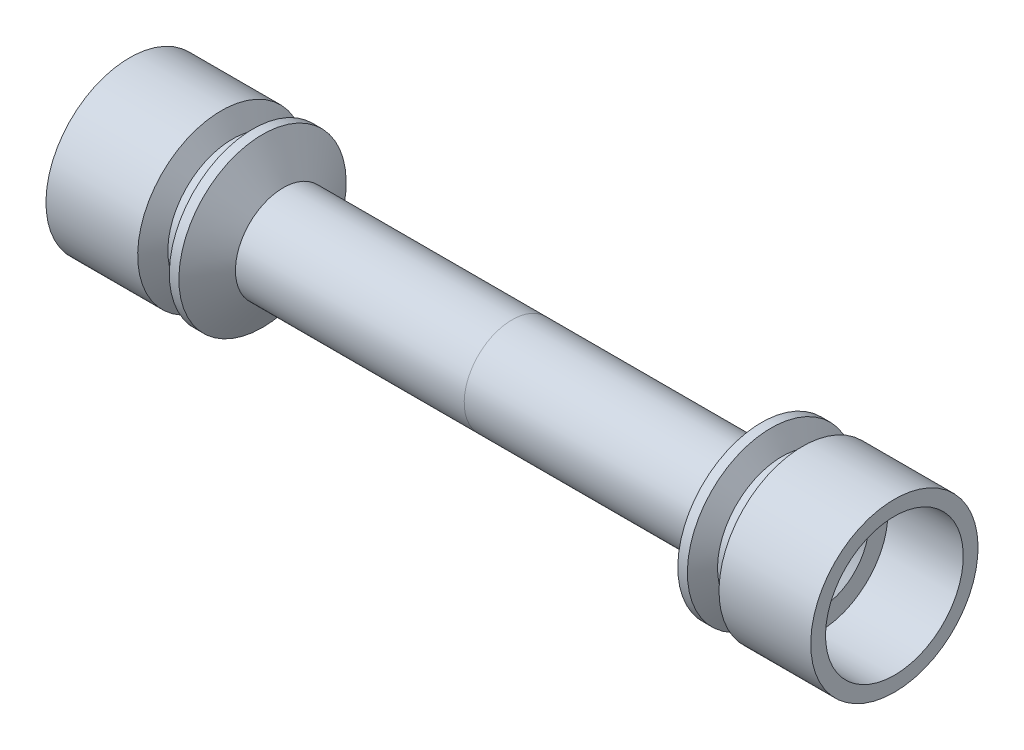
ISO-10303-21;
HEADER;
FILE_DESCRIPTION(('STEP AP214'),'2;1');
FILE_NAME('part.step','',(''),(''),'','','');
FILE_SCHEMA(('AUTOMOTIVE_DESIGN { 1 0 10303 214 1 1 1 1 }'));
ENDSEC;
DATA;
#1=APPLICATION_CONTEXT('core data for automotive mechanical design processes');
#2=APPLICATION_PROTOCOL_DEFINITION('international standard','automotive_design',2000,#1);
#3=PRODUCT_CONTEXT('',#1,'mechanical');
#4=PRODUCT('Part','Part','',(#3));
#5=PRODUCT_RELATED_PRODUCT_CATEGORY('part','',(#4));
#6=PRODUCT_DEFINITION_FORMATION('','',#4);
#7=PRODUCT_DEFINITION_CONTEXT('part definition',#1,'design');
#8=PRODUCT_DEFINITION('design','',#6,#7);
#9=PRODUCT_DEFINITION_SHAPE('','',#8);
#10=(LENGTH_UNIT() NAMED_UNIT(*) SI_UNIT(.MILLI.,.METRE.));
#11=(NAMED_UNIT(*) PLANE_ANGLE_UNIT() SI_UNIT($,.RADIAN.));
#12=(NAMED_UNIT(*) SI_UNIT($,.STERADIAN.) SOLID_ANGLE_UNIT());
#13=UNCERTAINTY_MEASURE_WITH_UNIT(LENGTH_MEASURE(1.E-05),#10,'distance_accuracy_value','');
#14=(GEOMETRIC_REPRESENTATION_CONTEXT(3) GLOBAL_UNCERTAINTY_ASSIGNED_CONTEXT((#13)) GLOBAL_UNIT_ASSIGNED_CONTEXT((#10,
#11,#12)) REPRESENTATION_CONTEXT('',''));
#15=CARTESIAN_POINT('',(0.,0.,0.));
#16=DIRECTION('',(0.,0.,1.));
#17=DIRECTION('',(1.,0.,0.));
#18=AXIS2_PLACEMENT_3D('',#15,#16,#17);
#19=CARTESIAN_POINT('',(16.5705151581292,0.,0.));
#20=DIRECTION('',(1.,0.,0.));
#21=DIRECTION('',(0.,-1.,0.));
#22=AXIS2_PLACEMENT_3D('',#19,#20,#21);
#23=CONICAL_SURFACE('',#22,5.55625,1.0471975511966);
#24=CARTESIAN_POINT('',(15.1956998296214,0.,0.));
#25=DIRECTION('',(-1.,0.,0.));
#26=DIRECTION('',(0.,-1.,0.));
#27=AXIS2_PLACEMENT_3D('',#24,#25,#26);
#28=CIRCLE('',#27,3.175);
#29=CARTESIAN_POINT('',(15.1956998296214,-3.175,0.));
#30=VERTEX_POINT('',#29);
#31=EDGE_CURVE('E177',#30,#30,#28,.T.);
#32=ORIENTED_EDGE('',*,*,#31,.F.);
#33=EDGE_LOOP('',(#32));
#34=FACE_BOUND('',#33,.T.);
#35=CARTESIAN_POINT('',(16.5705151581292,0.,0.));
#36=DIRECTION('',(-1.,0.,0.));
#37=DIRECTION('',(0.,-1.,0.));
#38=AXIS2_PLACEMENT_3D('',#35,#36,#37);
#39=CIRCLE('',#38,5.55625);
#40=CARTESIAN_POINT('',(16.5705151581292,-5.55625,0.));
#41=VERTEX_POINT('',#40);
#42=EDGE_CURVE('E12',#41,#41,#39,.T.);
#43=ORIENTED_EDGE('',*,*,#42,.T.);
#44=EDGE_LOOP('',(#43));
#45=FACE_BOUND('',#44,.T.);
#46=ADVANCED_FACE('F59',(#34,#45),#23,.T.);
#47=CARTESIAN_POINT('',(25.4,0.,0.));
#48=DIRECTION('',(1.,0.,0.));
#49=DIRECTION('',(0.,-1.,0.));
#50=AXIS2_PLACEMENT_3D('',#47,#48,#49);
#51=CYLINDRICAL_SURFACE('',#50,5.55625);
#52=ORIENTED_EDGE('',*,*,#42,.F.);
#53=EDGE_LOOP('',(#52));
#54=FACE_BOUND('',#53,.T.);
#55=CARTESIAN_POINT('',(17.2055151581292,0.,0.));
#56=DIRECTION('',(-1.,0.,0.));
#57=DIRECTION('',(0.,-1.,0.));
#58=AXIS2_PLACEMENT_3D('',#55,#56,#57);
#59=CIRCLE('',#58,5.55625);
#60=CARTESIAN_POINT('',(17.2055151581292,-5.55625,0.));
#61=VERTEX_POINT('',#60);
#62=EDGE_CURVE('E66',#61,#61,#59,.T.);
#63=ORIENTED_EDGE('',*,*,#62,.T.);
#64=EDGE_LOOP('',(#63));
#65=FACE_BOUND('',#64,.T.);
#66=ADVANCED_FACE('F131',(#54,#65),#51,.T.);
#67=CARTESIAN_POINT('',(17.93875,0.,0.));
#68=DIRECTION('',(-1.,0.,0.));
#69=DIRECTION('',(0.,1.,0.));
#70=AXIS2_PLACEMENT_3D('',#67,#68,#69);
#71=CONICAL_SURFACE('',#70,4.28625,1.0471975511966);
#72=ORIENTED_EDGE('',*,*,#62,.F.);
#73=EDGE_LOOP('',(#72));
#74=FACE_BOUND('',#73,.T.);
#75=CARTESIAN_POINT('',(17.93875,0.,0.));
#76=DIRECTION('',(-1.,0.,0.));
#77=DIRECTION('',(0.,-1.,0.));
#78=AXIS2_PLACEMENT_3D('',#75,#76,#77);
#79=CIRCLE('',#78,4.28625);
#80=CARTESIAN_POINT('',(17.93875,-4.28625,0.));
#81=VERTEX_POINT('',#80);
#82=EDGE_CURVE('E124',#81,#81,#79,.T.);
#83=ORIENTED_EDGE('',*,*,#82,.T.);
#84=EDGE_LOOP('',(#83));
#85=FACE_BOUND('',#84,.T.);
#86=ADVANCED_FACE('F133',(#74,#85),#71,.T.);
#87=CARTESIAN_POINT('',(25.4,0.,0.));
#88=DIRECTION('',(1.,0.,0.));
#89=DIRECTION('',(0.,-1.,0.));
#90=AXIS2_PLACEMENT_3D('',#87,#88,#89);
#91=CYLINDRICAL_SURFACE('',#90,4.28625);
#92=ORIENTED_EDGE('',*,*,#82,.F.);
#93=EDGE_LOOP('',(#92));
#94=FACE_BOUND('',#93,.T.);
#95=CARTESIAN_POINT('',(18.57375,0.,0.));
#96=DIRECTION('',(-1.,0.,0.));
#97=DIRECTION('',(0.,-1.,0.));
#98=AXIS2_PLACEMENT_3D('',#95,#96,#97);
#99=CIRCLE('',#98,4.28625);
#100=CARTESIAN_POINT('',(18.57375,-4.28625,0.));
#101=VERTEX_POINT('',#100);
#102=EDGE_CURVE('E120',#101,#101,#99,.T.);
#103=ORIENTED_EDGE('',*,*,#102,.T.);
#104=EDGE_LOOP('',(#103));
#105=FACE_BOUND('',#104,.T.);
#106=ADVANCED_FACE('F136',(#94,#105),#91,.T.);
#107=CARTESIAN_POINT('',(19.3069848418708,0.,0.));
#108=DIRECTION('',(1.,0.,0.));
#109=DIRECTION('',(0.,-1.,0.));
#110=AXIS2_PLACEMENT_3D('',#107,#108,#109);
#111=CONICAL_SURFACE('',#110,5.55625,1.0471975511966);
#112=ORIENTED_EDGE('',*,*,#102,.F.);
#113=EDGE_LOOP('',(#112));
#114=FACE_BOUND('',#113,.T.);
#115=CARTESIAN_POINT('',(19.3069848418708,0.,0.));
#116=DIRECTION('',(-1.,0.,0.));
#117=DIRECTION('',(0.,-1.,0.));
#118=AXIS2_PLACEMENT_3D('',#115,#116,#117);
#119=CIRCLE('',#118,5.55625);
#120=CARTESIAN_POINT('',(19.3069848418708,-5.55625,0.));
#121=VERTEX_POINT('',#120);
#122=EDGE_CURVE('E116',#121,#121,#119,.T.);
#123=ORIENTED_EDGE('',*,*,#122,.T.);
#124=EDGE_LOOP('',(#123));
#125=FACE_BOUND('',#124,.T.);
#126=ADVANCED_FACE('F142',(#114,#125),#111,.T.);
#127=CARTESIAN_POINT('',(25.4,0.,0.));
#128=DIRECTION('',(1.,0.,0.));
#129=DIRECTION('',(0.,-1.,0.));
#130=AXIS2_PLACEMENT_3D('',#127,#128,#129);
#131=CYLINDRICAL_SURFACE('',#130,5.55625);
#132=ORIENTED_EDGE('',*,*,#122,.F.);
#133=EDGE_LOOP('',(#132));
#134=FACE_BOUND('',#133,.T.);
#135=CARTESIAN_POINT('',(25.4,0.,0.));
#136=DIRECTION('',(-1.,0.,0.));
#137=DIRECTION('',(0.,-1.,0.));
#138=AXIS2_PLACEMENT_3D('',#135,#136,#137);
#139=CIRCLE('',#138,5.55625);
#140=CARTESIAN_POINT('',(25.4,-5.55625,0.));
#141=VERTEX_POINT('',#140);
#142=EDGE_CURVE('E112',#141,#141,#139,.T.);
#143=ORIENTED_EDGE('',*,*,#142,.T.);
#144=EDGE_LOOP('',(#143));
#145=FACE_BOUND('',#144,.T.);
#146=ADVANCED_FACE('F148',(#134,#145),#131,.T.);
#147=CARTESIAN_POINT('',(25.4,0.,0.));
#148=DIRECTION('',(-1.,0.,0.));
#149=DIRECTION('',(0.,1.,0.));
#150=AXIS2_PLACEMENT_3D('',#147,#148,#149);
#151=PLANE('',#150);
#152=CARTESIAN_POINT('',(25.4,0.,0.));
#153=DIRECTION('',(-1.,0.,0.));
#154=DIRECTION('',(0.,-1.,0.));
#155=AXIS2_PLACEMENT_3D('',#152,#153,#154);
#156=CIRCLE('',#155,4.575);
#157=CARTESIAN_POINT('',(25.4,-4.575,0.));
#158=VERTEX_POINT('',#157);
#159=EDGE_CURVE('E108',#158,#158,#156,.T.);
#160=ORIENTED_EDGE('',*,*,#159,.T.);
#161=EDGE_LOOP('',(#160));
#162=FACE_BOUND('',#161,.T.);
#163=ORIENTED_EDGE('',*,*,#142,.F.);
#164=EDGE_LOOP('',(#163));
#165=FACE_BOUND('',#164,.T.);
#166=ADVANCED_FACE('F154',(#162,#165),#151,.F.);
#167=CARTESIAN_POINT('',(25.4,0.,0.));
#168=DIRECTION('',(1.,0.,0.));
#169=DIRECTION('',(0.,-1.,0.));
#170=AXIS2_PLACEMENT_3D('',#167,#168,#169);
#171=CYLINDRICAL_SURFACE('',#170,4.575);
#172=CARTESIAN_POINT('',(20.4,0.,0.));
#173=DIRECTION('',(-1.,0.,0.));
#174=DIRECTION('',(0.,-1.,0.));
#175=AXIS2_PLACEMENT_3D('',#172,#173,#174);
#176=CIRCLE('',#175,4.575);
#177=CARTESIAN_POINT('',(20.4,-4.575,0.));
#178=VERTEX_POINT('',#177);
#179=EDGE_CURVE('E104',#178,#178,#176,.T.);
#180=ORIENTED_EDGE('',*,*,#179,.T.);
#181=EDGE_LOOP('',(#180));
#182=FACE_BOUND('',#181,.T.);
#183=ORIENTED_EDGE('',*,*,#159,.F.);
#184=EDGE_LOOP('',(#183));
#185=FACE_BOUND('',#184,.T.);
#186=ADVANCED_FACE('F159',(#182,#185),#171,.F.);
#187=CARTESIAN_POINT('',(20.4,0.,0.));
#188=DIRECTION('',(-1.,0.,0.));
#189=DIRECTION('',(0.,1.,0.));
#190=AXIS2_PLACEMENT_3D('',#187,#188,#189);
#191=PLANE('',#190);
#192=CARTESIAN_POINT('',(20.4,0.,0.));
#193=DIRECTION('',(-1.,0.,0.));
#194=DIRECTION('',(0.,-1.,0.));
#195=AXIS2_PLACEMENT_3D('',#192,#193,#194);
#196=CIRCLE('',#195,3.30500000000001);
#197=CARTESIAN_POINT('',(20.4,-3.30500000000001,0.));
#198=VERTEX_POINT('',#197);
#199=EDGE_CURVE('E100',#198,#198,#196,.T.);
#200=ORIENTED_EDGE('',*,*,#199,.T.);
#201=EDGE_LOOP('',(#200));
#202=FACE_BOUND('',#201,.T.);
#203=ORIENTED_EDGE('',*,*,#179,.F.);
#204=EDGE_LOOP('',(#203));
#205=FACE_BOUND('',#204,.T.);
#206=ADVANCED_FACE('F165',(#202,#205),#191,.F.);
#207=CARTESIAN_POINT('',(20.4,0.,0.));
#208=DIRECTION('',(1.,0.,0.));
#209=DIRECTION('',(0.,-1.,0.));
#210=AXIS2_PLACEMENT_3D('',#207,#208,#209);
#211=CONICAL_SURFACE('',#210,3.30500000000001,0.785398163397449);
#212=CARTESIAN_POINT('',(19.892,0.,0.));
#213=DIRECTION('',(-1.,0.,0.));
#214=DIRECTION('',(0.,-1.,0.));
#215=AXIS2_PLACEMENT_3D('',#212,#213,#214);
#216=CIRCLE('',#215,2.797);
#217=CARTESIAN_POINT('',(19.892,-2.797,0.));
#218=VERTEX_POINT('',#217);
#219=EDGE_CURVE('E96',#218,#218,#216,.T.);
#220=ORIENTED_EDGE('',*,*,#219,.T.);
#221=EDGE_LOOP('',(#220));
#222=FACE_BOUND('',#221,.T.);
#223=ORIENTED_EDGE('',*,*,#199,.F.);
#224=EDGE_LOOP('',(#223));
#225=FACE_BOUND('',#224,.T.);
#226=ADVANCED_FACE('F209',(#222,#225),#211,.F.);
#227=CARTESIAN_POINT('',(19.892,0.,0.));
#228=DIRECTION('',(-1.,0.,0.));
#229=DIRECTION('',(0.,1.,0.));
#230=AXIS2_PLACEMENT_3D('',#227,#228,#229);
#231=PLANE('',#230);
#232=CARTESIAN_POINT('',(19.892,0.,0.));
#233=DIRECTION('',(-1.,0.,0.));
#234=DIRECTION('',(0.,-1.,0.));
#235=AXIS2_PLACEMENT_3D('',#232,#233,#234);
#236=CIRCLE('',#235,1.7145);
#237=CARTESIAN_POINT('',(19.892,-1.7145,0.));
#238=VERTEX_POINT('',#237);
#239=EDGE_CURVE('E86',#238,#238,#236,.T.);
#240=ORIENTED_EDGE('',*,*,#239,.T.);
#241=EDGE_LOOP('',(#240));
#242=FACE_BOUND('',#241,.T.);
#243=ORIENTED_EDGE('',*,*,#219,.F.);
#244=EDGE_LOOP('',(#243));
#245=FACE_BOUND('',#244,.T.);
#246=ADVANCED_FACE('F205',(#242,#245),#231,.F.);
#247=CARTESIAN_POINT('',(25.4,0.,0.));
#248=DIRECTION('',(1.,0.,0.));
#249=DIRECTION('',(0.,-1.,0.));
#250=AXIS2_PLACEMENT_3D('',#247,#248,#249);
#251=CYLINDRICAL_SURFACE('',#250,1.7145);
#252=CARTESIAN_POINT('',(15.575,0.,0.));
#253=DIRECTION('',(-1.,0.,0.));
#254=DIRECTION('',(0.,-1.,0.));
#255=AXIS2_PLACEMENT_3D('',#252,#253,#254);
#256=CIRCLE('',#255,1.7145);
#257=CARTESIAN_POINT('',(15.575,-1.7145,0.));
#258=VERTEX_POINT('',#257);
#259=EDGE_CURVE('E80',#258,#258,#256,.T.);
#260=ORIENTED_EDGE('',*,*,#259,.T.);
#261=EDGE_LOOP('',(#260));
#262=FACE_BOUND('',#261,.T.);
#263=ORIENTED_EDGE('',*,*,#239,.F.);
#264=EDGE_LOOP('',(#263));
#265=FACE_BOUND('',#264,.T.);
#266=ADVANCED_FACE('F201',(#262,#265),#251,.F.);
#267=CARTESIAN_POINT('',(15.575,0.,0.));
#268=DIRECTION('',(-1.,0.,0.));
#269=DIRECTION('',(0.,1.,0.));
#270=AXIS2_PLACEMENT_3D('',#267,#268,#269);
#271=PLANE('',#270);
#272=ORIENTED_EDGE('',*,*,#259,.F.);
#273=EDGE_LOOP('',(#272));
#274=FACE_BOUND('',#273,.T.);
#275=ADVANCED_FACE('F73',(#274),#271,.F.);
#276=CARTESIAN_POINT('',(12.5,0.,0.));
#277=DIRECTION('',(-1.,0.,0.));
#278=DIRECTION('',(0.,1.,0.));
#279=AXIS2_PLACEMENT_3D('',#276,#277,#278);
#280=CONICAL_SURFACE('',#279,1.6,0.78539816339745);
#281=CARTESIAN_POINT('',(14.1,0.,0.));
#282=VERTEX_POINT('',#281);
#283=VERTEX_LOOP('',#282);
#284=FACE_BOUND('',#283,.T.);
#285=CARTESIAN_POINT('',(12.5,0.,0.));
#286=DIRECTION('',(-1.,0.,0.));
#287=DIRECTION('',(0.,-1.,0.));
#288=AXIS2_PLACEMENT_3D('',#285,#286,#287);
#289=CIRCLE('',#288,1.6);
#290=CARTESIAN_POINT('',(12.5,-1.6,0.));
#291=VERTEX_POINT('',#290);
#292=EDGE_CURVE('E77',#291,#291,#289,.T.);
#293=ORIENTED_EDGE('',*,*,#292,.T.);
#294=EDGE_LOOP('',(#293));
#295=FACE_BOUND('',#294,.T.);
#296=ADVANCED_FACE('F69',(#284,#295),#280,.F.);
#297=CARTESIAN_POINT('',(25.4,0.,0.));
#298=DIRECTION('',(1.,0.,0.));
#299=DIRECTION('',(0.,-1.,0.));
#300=AXIS2_PLACEMENT_3D('',#297,#298,#299);
#301=CYLINDRICAL_SURFACE('',#300,1.6);
#302=ORIENTED_EDGE('',*,*,#292,.F.);
#303=EDGE_LOOP('',(#302));
#304=FACE_BOUND('',#303,.T.);
#305=CARTESIAN_POINT('',(0.,0.,0.));
#306=DIRECTION('',(-1.,0.,0.));
#307=DIRECTION('',(0.,-1.,0.));
#308=AXIS2_PLACEMENT_3D('',#305,#306,#307);
#309=CIRCLE('',#308,1.6);
#310=CARTESIAN_POINT('',(0.,-1.6,0.));
#311=VERTEX_POINT('',#310);
#312=EDGE_CURVE('E81',#311,#311,#309,.T.);
#313=ORIENTED_EDGE('',*,*,#312,.T.);
#314=EDGE_LOOP('',(#313));
#315=FACE_BOUND('',#314,.T.);
#316=ADVANCED_FACE('F72',(#304,#315),#301,.F.);
#317=CARTESIAN_POINT('',(0.,0.,0.));
#318=DIRECTION('',(1.,0.,0.));
#319=DIRECTION('',(0.,-1.,0.));
#320=AXIS2_PLACEMENT_3D('',#317,#318,#319);
#321=PLANE('',#320);
#322=CARTESIAN_POINT('',(0.,0.,0.));
#323=DIRECTION('',(-1.,0.,0.));
#324=DIRECTION('',(0.,-1.,0.));
#325=AXIS2_PLACEMENT_3D('',#322,#323,#324);
#326=CIRCLE('',#325,3.175);
#327=CARTESIAN_POINT('',(0.,-3.175,0.));
#328=VERTEX_POINT('',#327);
#329=EDGE_CURVE('E89',#328,#328,#326,.T.);
#330=ORIENTED_EDGE('',*,*,#329,.T.);
#331=EDGE_LOOP('',(#330));
#332=FACE_BOUND('',#331,.T.);
#333=ORIENTED_EDGE('',*,*,#312,.F.);
#334=EDGE_LOOP('',(#333));
#335=FACE_BOUND('',#334,.T.);
#336=ADVANCED_FACE('F186',(#332,#335),#321,.F.);
#337=CARTESIAN_POINT('',(25.4,0.,0.));
#338=DIRECTION('',(1.,0.,0.));
#339=DIRECTION('',(0.,-1.,0.));
#340=AXIS2_PLACEMENT_3D('',#337,#338,#339);
#341=CYLINDRICAL_SURFACE('',#340,3.175);
#342=ORIENTED_EDGE('',*,*,#329,.F.);
#343=EDGE_LOOP('',(#342));
#344=FACE_BOUND('',#343,.T.);
#345=ORIENTED_EDGE('',*,*,#31,.T.);
#346=EDGE_LOOP('',(#345));
#347=FACE_BOUND('',#346,.T.);
#348=ADVANCED_FACE('F189',(#344,#347),#341,.T.);
#349=CLOSED_SHELL('',(#46,#66,#86,#106,#126,#146,#166,#186,#206,#226,#246,#266,#275,#296,#316,
#336,#348));
#350=MANIFOLD_SOLID_BREP('B2',#349);
#351=CARTESIAN_POINT('',(-16.5705151581292,0.,0.));
#352=DIRECTION('',(-1.,0.,0.));
#353=DIRECTION('',(0.,-1.,0.));
#354=AXIS2_PLACEMENT_3D('',#351,#352,#353);
#355=CONICAL_SURFACE('',#354,5.55625,1.0471975511966);
#356=CARTESIAN_POINT('',(-15.1956998296214,0.,0.));
#357=DIRECTION('',(-1.,0.,0.));
#358=DIRECTION('',(0.,-1.,0.));
#359=AXIS2_PLACEMENT_3D('',#356,#357,#358);
#360=CIRCLE('',#359,3.175);
#361=CARTESIAN_POINT('',(-15.1956998296214,-3.175,0.));
#362=VERTEX_POINT('',#361);
#363=EDGE_CURVE('E467',#362,#362,#360,.T.);
#364=ORIENTED_EDGE('',*,*,#363,.T.);
#365=EDGE_LOOP('',(#364));
#366=FACE_BOUND('',#365,.T.);
#367=CARTESIAN_POINT('',(-16.5705151581292,0.,0.));
#368=DIRECTION('',(-1.,0.,0.));
#369=DIRECTION('',(0.,-1.,0.));
#370=AXIS2_PLACEMENT_3D('',#367,#368,#369);
#371=CIRCLE('',#370,5.55625);
#372=CARTESIAN_POINT('',(-16.5705151581292,-5.55625,0.));
#373=VERTEX_POINT('',#372);
#374=EDGE_CURVE('E386',#373,#373,#371,.T.);
#375=ORIENTED_EDGE('',*,*,#374,.F.);
#376=EDGE_LOOP('',(#375));
#377=FACE_BOUND('',#376,.T.);
#378=ADVANCED_FACE('F328',(#366,#377),#355,.T.);
#379=CARTESIAN_POINT('',(-25.4,0.,0.));
#380=DIRECTION('',(-1.,0.,0.));
#381=DIRECTION('',(0.,-1.,0.));
#382=AXIS2_PLACEMENT_3D('',#379,#380,#381);
#383=CYLINDRICAL_SURFACE('',#382,5.55625);
#384=ORIENTED_EDGE('',*,*,#374,.T.);
#385=EDGE_LOOP('',(#384));
#386=FACE_BOUND('',#385,.T.);
#387=CARTESIAN_POINT('',(-17.2055151581292,0.,0.));
#388=DIRECTION('',(-1.,0.,0.));
#389=DIRECTION('',(0.,-1.,0.));
#390=AXIS2_PLACEMENT_3D('',#387,#388,#389);
#391=CIRCLE('',#390,5.55625);
#392=CARTESIAN_POINT('',(-17.2055151581292,-5.55625,0.));
#393=VERTEX_POINT('',#392);
#394=EDGE_CURVE('E383',#393,#393,#391,.T.);
#395=ORIENTED_EDGE('',*,*,#394,.F.);
#396=EDGE_LOOP('',(#395));
#397=FACE_BOUND('',#396,.T.);
#398=ADVANCED_FACE('F406',(#386,#397),#383,.T.);
#399=CARTESIAN_POINT('',(-17.93875,0.,0.));
#400=DIRECTION('',(1.,0.,0.));
#401=DIRECTION('',(0.,1.,0.));
#402=AXIS2_PLACEMENT_3D('',#399,#400,#401);
#403=CONICAL_SURFACE('',#402,4.28625,1.0471975511966);
#404=ORIENTED_EDGE('',*,*,#394,.T.);
#405=EDGE_LOOP('',(#404));
#406=FACE_BOUND('',#405,.T.);
#407=CARTESIAN_POINT('',(-17.93875,0.,0.));
#408=DIRECTION('',(-1.,0.,0.));
#409=DIRECTION('',(0.,-1.,0.));
#410=AXIS2_PLACEMENT_3D('',#407,#408,#409);
#411=CIRCLE('',#410,4.28625);
#412=CARTESIAN_POINT('',(-17.93875,-4.28625,0.));
#413=VERTEX_POINT('',#412);
#414=EDGE_CURVE('E380',#413,#413,#411,.T.);
#415=ORIENTED_EDGE('',*,*,#414,.F.);
#416=EDGE_LOOP('',(#415));
#417=FACE_BOUND('',#416,.T.);
#418=ADVANCED_FACE('F411',(#406,#417),#403,.T.);
#419=CARTESIAN_POINT('',(-25.4,0.,0.));
#420=DIRECTION('',(-1.,0.,0.));
#421=DIRECTION('',(0.,-1.,0.));
#422=AXIS2_PLACEMENT_3D('',#419,#420,#421);
#423=CYLINDRICAL_SURFACE('',#422,4.28625);
#424=ORIENTED_EDGE('',*,*,#414,.T.);
#425=EDGE_LOOP('',(#424));
#426=FACE_BOUND('',#425,.T.);
#427=CARTESIAN_POINT('',(-18.57375,0.,0.));
#428=DIRECTION('',(-1.,0.,0.));
#429=DIRECTION('',(0.,-1.,0.));
#430=AXIS2_PLACEMENT_3D('',#427,#428,#429);
#431=CIRCLE('',#430,4.28625);
#432=CARTESIAN_POINT('',(-18.57375,-4.28625,0.));
#433=VERTEX_POINT('',#432);
#434=EDGE_CURVE('E377',#433,#433,#431,.T.);
#435=ORIENTED_EDGE('',*,*,#434,.F.);
#436=EDGE_LOOP('',(#435));
#437=FACE_BOUND('',#436,.T.);
#438=ADVANCED_FACE('F419',(#426,#437),#423,.T.);
#439=CARTESIAN_POINT('',(-19.3069848418708,0.,0.));
#440=DIRECTION('',(-1.,0.,0.));
#441=DIRECTION('',(0.,-1.,0.));
#442=AXIS2_PLACEMENT_3D('',#439,#440,#441);
#443=CONICAL_SURFACE('',#442,5.55625,1.0471975511966);
#444=ORIENTED_EDGE('',*,*,#434,.T.);
#445=EDGE_LOOP('',(#444));
#446=FACE_BOUND('',#445,.T.);
#447=CARTESIAN_POINT('',(-19.3069848418708,0.,0.));
#448=DIRECTION('',(-1.,0.,0.));
#449=DIRECTION('',(0.,-1.,0.));
#450=AXIS2_PLACEMENT_3D('',#447,#448,#449);
#451=CIRCLE('',#450,5.55625);
#452=CARTESIAN_POINT('',(-19.3069848418708,-5.55625,0.));
#453=VERTEX_POINT('',#452);
#454=EDGE_CURVE('E374',#453,#453,#451,.T.);
#455=ORIENTED_EDGE('',*,*,#454,.F.);
#456=EDGE_LOOP('',(#455));
#457=FACE_BOUND('',#456,.T.);
#458=ADVANCED_FACE('F423',(#446,#457),#443,.T.);
#459=CARTESIAN_POINT('',(-25.4,0.,0.));
#460=DIRECTION('',(-1.,0.,0.));
#461=DIRECTION('',(0.,-1.,0.));
#462=AXIS2_PLACEMENT_3D('',#459,#460,#461);
#463=CYLINDRICAL_SURFACE('',#462,5.55625);
#464=ORIENTED_EDGE('',*,*,#454,.T.);
#465=EDGE_LOOP('',(#464));
#466=FACE_BOUND('',#465,.T.);
#467=CARTESIAN_POINT('',(-25.4,0.,0.));
#468=DIRECTION('',(-1.,0.,0.));
#469=DIRECTION('',(0.,-1.,0.));
#470=AXIS2_PLACEMENT_3D('',#467,#468,#469);
#471=CIRCLE('',#470,5.55625);
#472=CARTESIAN_POINT('',(-25.4,-5.55625,0.));
#473=VERTEX_POINT('',#472);
#474=EDGE_CURVE('E371',#473,#473,#471,.T.);
#475=ORIENTED_EDGE('',*,*,#474,.F.);
#476=EDGE_LOOP('',(#475));
#477=FACE_BOUND('',#476,.T.);
#478=ADVANCED_FACE('F427',(#466,#477),#463,.T.);
#479=CARTESIAN_POINT('',(-25.4,0.,0.));
#480=DIRECTION('',(1.,0.,0.));
#481=DIRECTION('',(0.,1.,0.));
#482=AXIS2_PLACEMENT_3D('',#479,#480,#481);
#483=PLANE('',#482);
#484=CARTESIAN_POINT('',(-25.4,0.,0.));
#485=DIRECTION('',(1.,0.,0.));
#486=DIRECTION('',(0.,1.,0.));
#487=AXIS2_PLACEMENT_3D('',#484,#485,#486);
#488=CIRCLE('',#487,5.083);
#489=CARTESIAN_POINT('',(-25.4,5.083,0.));
#490=VERTEX_POINT('',#489);
#491=EDGE_CURVE('E57',#490,#490,#488,.T.);
#492=ORIENTED_EDGE('',*,*,#491,.T.);
#493=EDGE_LOOP('',(#492));
#494=FACE_BOUND('',#493,.T.);
#495=ORIENTED_EDGE('',*,*,#474,.T.);
#496=EDGE_LOOP('',(#495));
#497=FACE_BOUND('',#496,.T.);
#498=ADVANCED_FACE('F431',(#494,#497),#483,.F.);
#499=CARTESIAN_POINT('',(-25.4,0.,0.));
#500=DIRECTION('',(-1.,0.,0.));
#501=DIRECTION('',(0.,-1.,0.));
#502=AXIS2_PLACEMENT_3D('',#499,#500,#501);
#503=CYLINDRICAL_SURFACE('',#502,4.575);
#504=CARTESIAN_POINT('',(-24.892,0.,0.));
#505=DIRECTION('',(1.,0.,0.));
#506=DIRECTION('',(0.,1.,0.));
#507=AXIS2_PLACEMENT_3D('',#504,#505,#506);
#508=CIRCLE('',#507,4.575);
#509=CARTESIAN_POINT('',(-24.892,4.575,0.));
#510=VERTEX_POINT('',#509);
#511=EDGE_CURVE('E336',#510,#510,#508,.F.);
#512=ORIENTED_EDGE('',*,*,#511,.T.);
#513=EDGE_LOOP('',(#512));
#514=FACE_BOUND('',#513,.T.);
#515=CARTESIAN_POINT('',(-20.4,0.,0.));
#516=DIRECTION('',(-1.,0.,0.));
#517=DIRECTION('',(0.,-1.,0.));
#518=AXIS2_PLACEMENT_3D('',#515,#516,#517);
#519=CIRCLE('',#518,4.575);
#520=CARTESIAN_POINT('',(-20.4,-4.575,0.));
#521=VERTEX_POINT('',#520);
#522=EDGE_CURVE('E368',#521,#521,#519,.T.);
#523=ORIENTED_EDGE('',*,*,#522,.F.);
#524=EDGE_LOOP('',(#523));
#525=FACE_BOUND('',#524,.T.);
#526=ADVANCED_FACE('F391',(#514,#525),#503,.F.);
#527=CARTESIAN_POINT('',(-20.4,0.,0.));
#528=DIRECTION('',(1.,0.,0.));
#529=DIRECTION('',(0.,1.,0.));
#530=AXIS2_PLACEMENT_3D('',#527,#528,#529);
#531=PLANE('',#530);
#532=CARTESIAN_POINT('',(-20.4,0.,0.));
#533=DIRECTION('',(-1.,0.,0.));
#534=DIRECTION('',(0.,-1.,0.));
#535=AXIS2_PLACEMENT_3D('',#532,#533,#534);
#536=CIRCLE('',#535,3.30500000000001);
#537=CARTESIAN_POINT('',(-20.4,-3.30500000000001,0.));
#538=VERTEX_POINT('',#537);
#539=EDGE_CURVE('E365',#538,#538,#536,.T.);
#540=ORIENTED_EDGE('',*,*,#539,.F.);
#541=EDGE_LOOP('',(#540));
#542=FACE_BOUND('',#541,.T.);
#543=ORIENTED_EDGE('',*,*,#522,.T.);
#544=EDGE_LOOP('',(#543));
#545=FACE_BOUND('',#544,.T.);
#546=ADVANCED_FACE('F437',(#542,#545),#531,.F.);
#547=CARTESIAN_POINT('',(-20.4,0.,0.));
#548=DIRECTION('',(-1.,0.,0.));
#549=DIRECTION('',(0.,-1.,0.));
#550=AXIS2_PLACEMENT_3D('',#547,#548,#549);
#551=CONICAL_SURFACE('',#550,3.30500000000001,0.785398163397449);
#552=CARTESIAN_POINT('',(-19.892,0.,0.));
#553=DIRECTION('',(-1.,0.,0.));
#554=DIRECTION('',(0.,-1.,0.));
#555=AXIS2_PLACEMENT_3D('',#552,#553,#554);
#556=CIRCLE('',#555,2.797);
#557=CARTESIAN_POINT('',(-19.892,-2.797,0.));
#558=VERTEX_POINT('',#557);
#559=EDGE_CURVE('E362',#558,#558,#556,.T.);
#560=ORIENTED_EDGE('',*,*,#559,.F.);
#561=EDGE_LOOP('',(#560));
#562=FACE_BOUND('',#561,.T.);
#563=ORIENTED_EDGE('',*,*,#539,.T.);
#564=EDGE_LOOP('',(#563));
#565=FACE_BOUND('',#564,.T.);
#566=ADVANCED_FACE('F440',(#562,#565),#551,.F.);
#567=CARTESIAN_POINT('',(-19.892,0.,0.));
#568=DIRECTION('',(1.,0.,0.));
#569=DIRECTION('',(0.,1.,0.));
#570=AXIS2_PLACEMENT_3D('',#567,#568,#569);
#571=PLANE('',#570);
#572=CARTESIAN_POINT('',(-19.892,0.,0.));
#573=DIRECTION('',(-1.,0.,0.));
#574=DIRECTION('',(0.,-1.,0.));
#575=AXIS2_PLACEMENT_3D('',#572,#573,#574);
#576=CIRCLE('',#575,1.7145);
#577=CARTESIAN_POINT('',(-19.892,-1.7145,0.));
#578=VERTEX_POINT('',#577);
#579=EDGE_CURVE('E353',#578,#578,#576,.T.);
#580=ORIENTED_EDGE('',*,*,#579,.F.);
#581=EDGE_LOOP('',(#580));
#582=FACE_BOUND('',#581,.T.);
#583=ORIENTED_EDGE('',*,*,#559,.T.);
#584=EDGE_LOOP('',(#583));
#585=FACE_BOUND('',#584,.T.);
#586=ADVANCED_FACE('F444',(#582,#585),#571,.F.);
#587=CARTESIAN_POINT('',(-25.4,0.,0.));
#588=DIRECTION('',(-1.,0.,0.));
#589=DIRECTION('',(0.,-1.,0.));
#590=AXIS2_PLACEMENT_3D('',#587,#588,#589);
#591=CYLINDRICAL_SURFACE('',#590,1.7145);
#592=CARTESIAN_POINT('',(-15.575,0.,0.));
#593=DIRECTION('',(-1.,0.,0.));
#594=DIRECTION('',(0.,-1.,0.));
#595=AXIS2_PLACEMENT_3D('',#592,#593,#594);
#596=CIRCLE('',#595,1.7145);
#597=CARTESIAN_POINT('',(-15.575,-1.7145,0.));
#598=VERTEX_POINT('',#597);
#599=EDGE_CURVE('E349',#598,#598,#596,.T.);
#600=ORIENTED_EDGE('',*,*,#599,.F.);
#601=EDGE_LOOP('',(#600));
#602=FACE_BOUND('',#601,.T.);
#603=ORIENTED_EDGE('',*,*,#579,.T.);
#604=EDGE_LOOP('',(#603));
#605=FACE_BOUND('',#604,.T.);
#606=ADVANCED_FACE('F448',(#602,#605),#591,.F.);
#607=CARTESIAN_POINT('',(-15.575,0.,0.));
#608=DIRECTION('',(1.,0.,0.));
#609=DIRECTION('',(0.,1.,0.));
#610=AXIS2_PLACEMENT_3D('',#607,#608,#609);
#611=PLANE('',#610);
#612=ORIENTED_EDGE('',*,*,#599,.T.);
#613=EDGE_LOOP('',(#612));
#614=FACE_BOUND('',#613,.T.);
#615=ADVANCED_FACE('F343',(#614),#611,.F.);
#616=CARTESIAN_POINT('',(-12.5,0.,0.));
#617=DIRECTION('',(1.,0.,0.));
#618=DIRECTION('',(0.,1.,0.));
#619=AXIS2_PLACEMENT_3D('',#616,#617,#618);
#620=CONICAL_SURFACE('',#619,1.6,0.78539816339745);
#621=CARTESIAN_POINT('',(-14.1,0.,0.));
#622=VERTEX_POINT('',#621);
#623=VERTEX_LOOP('',#622);
#624=FACE_BOUND('',#623,.T.);
#625=CARTESIAN_POINT('',(-12.5,0.,0.));
#626=DIRECTION('',(-1.,0.,0.));
#627=DIRECTION('',(0.,-1.,0.));
#628=AXIS2_PLACEMENT_3D('',#625,#626,#627);
#629=CIRCLE('',#628,1.6);
#630=CARTESIAN_POINT('',(-12.5,-1.6,0.));
#631=VERTEX_POINT('',#630);
#632=EDGE_CURVE('E347',#631,#631,#629,.T.);
#633=ORIENTED_EDGE('',*,*,#632,.F.);
#634=EDGE_LOOP('',(#633));
#635=FACE_BOUND('',#634,.T.);
#636=ADVANCED_FACE('F339',(#624,#635),#620,.F.);
#637=CARTESIAN_POINT('',(-25.4,0.,0.));
#638=DIRECTION('',(-1.,0.,0.));
#639=DIRECTION('',(0.,-1.,0.));
#640=AXIS2_PLACEMENT_3D('',#637,#638,#639);
#641=CYLINDRICAL_SURFACE('',#640,1.6);
#642=ORIENTED_EDGE('',*,*,#632,.T.);
#643=EDGE_LOOP('',(#642));
#644=FACE_BOUND('',#643,.T.);
#645=CARTESIAN_POINT('',(0.,0.,0.));
#646=DIRECTION('',(-1.,0.,0.));
#647=DIRECTION('',(0.,-1.,0.));
#648=AXIS2_PLACEMENT_3D('',#645,#646,#647);
#649=CIRCLE('',#648,1.6);
#650=CARTESIAN_POINT('',(0.,-1.6,0.));
#651=VERTEX_POINT('',#650);
#652=EDGE_CURVE('E350',#651,#651,#649,.T.);
#653=ORIENTED_EDGE('',*,*,#652,.F.);
#654=EDGE_LOOP('',(#653));
#655=FACE_BOUND('',#654,.T.);
#656=ADVANCED_FACE('F342',(#644,#655),#641,.F.);
#657=CARTESIAN_POINT('',(0.,0.,0.));
#658=DIRECTION('',(-1.,0.,0.));
#659=DIRECTION('',(0.,-1.,0.));
#660=AXIS2_PLACEMENT_3D('',#657,#658,#659);
#661=PLANE('',#660);
#662=CARTESIAN_POINT('',(0.,0.,0.));
#663=DIRECTION('',(-1.,0.,0.));
#664=DIRECTION('',(0.,-1.,0.));
#665=AXIS2_PLACEMENT_3D('',#662,#663,#664);
#666=CIRCLE('',#665,3.175);
#667=CARTESIAN_POINT('',(0.,-3.175,0.));
#668=VERTEX_POINT('',#667);
#669=EDGE_CURVE('E356',#668,#668,#666,.T.);
#670=ORIENTED_EDGE('',*,*,#669,.F.);
#671=EDGE_LOOP('',(#670));
#672=FACE_BOUND('',#671,.T.);
#673=ORIENTED_EDGE('',*,*,#652,.T.);
#674=EDGE_LOOP('',(#673));
#675=FACE_BOUND('',#674,.T.);
#676=ADVANCED_FACE('F401',(#672,#675),#661,.F.);
#677=CARTESIAN_POINT('',(-25.4,0.,0.));
#678=DIRECTION('',(-1.,0.,0.));
#679=DIRECTION('',(0.,-1.,0.));
#680=AXIS2_PLACEMENT_3D('',#677,#678,#679);
#681=CYLINDRICAL_SURFACE('',#680,3.175);
#682=ORIENTED_EDGE('',*,*,#669,.T.);
#683=EDGE_LOOP('',(#682));
#684=FACE_BOUND('',#683,.T.);
#685=ORIENTED_EDGE('',*,*,#363,.F.);
#686=EDGE_LOOP('',(#685));
#687=FACE_BOUND('',#686,.T.);
#688=ADVANCED_FACE('F395',(#684,#687),#681,.T.);
#689=CARTESIAN_POINT('',(-24.892,0.,0.));
#690=DIRECTION('',(-1.,0.,0.));
#691=DIRECTION('',(0.,-1.,0.));
#692=AXIS2_PLACEMENT_3D('',#689,#690,#691);
#693=CONICAL_SURFACE('',#692,4.575,0.785398163397454);
#694=ORIENTED_EDGE('',*,*,#491,.F.);
#695=EDGE_LOOP('',(#694));
#696=FACE_BOUND('',#695,.T.);
#697=ORIENTED_EDGE('',*,*,#511,.F.);
#698=EDGE_LOOP('',(#697));
#699=FACE_BOUND('',#698,.T.);
#700=ADVANCED_FACE('F331',(#696,#699),#693,.F.);
#701=CLOSED_SHELL('',(#378,#398,#418,#438,#458,#478,#498,#526,#546,#566,#586,#606,#615,#636,
#656,#676,#688,#700));
#702=MANIFOLD_SOLID_BREP('B6',#701);
#703=ADVANCED_BREP_SHAPE_REPRESENTATION('',(#18,#350,#702),#14);
#704=SHAPE_DEFINITION_REPRESENTATION(#9,#703);
ENDSEC;
END-ISO-10303-21;
